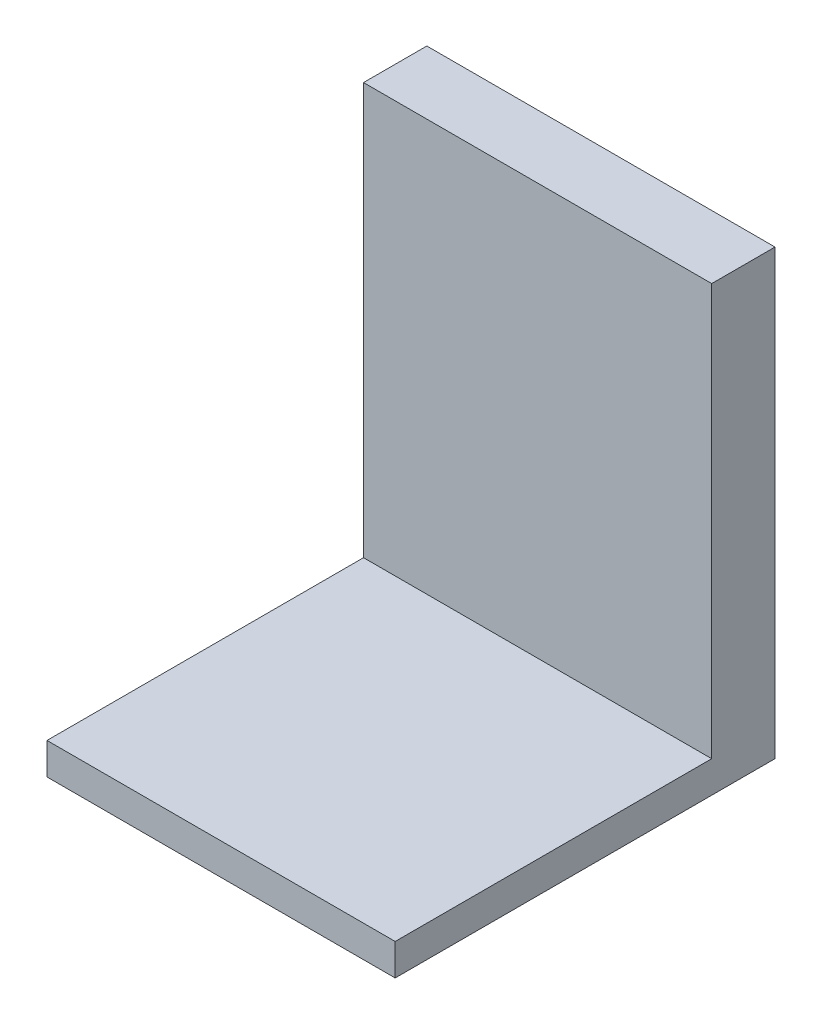
ISO-10303-21;
HEADER;
FILE_DESCRIPTION(('STEP AP214'),'2;1');
FILE_NAME('part.step','',(''),(''),'','','');
FILE_SCHEMA(('AUTOMOTIVE_DESIGN { 1 0 10303 214 1 1 1 1 }'));
ENDSEC;
DATA;
#1=APPLICATION_CONTEXT('core data for automotive mechanical design processes');
#2=APPLICATION_PROTOCOL_DEFINITION('international standard','automotive_design',2000,#1);
#3=PRODUCT_CONTEXT('',#1,'mechanical');
#4=PRODUCT('Part','Part','',(#3));
#5=PRODUCT_RELATED_PRODUCT_CATEGORY('part','',(#4));
#6=PRODUCT_DEFINITION_FORMATION('','',#4);
#7=PRODUCT_DEFINITION_CONTEXT('part definition',#1,'design');
#8=PRODUCT_DEFINITION('design','',#6,#7);
#9=PRODUCT_DEFINITION_SHAPE('','',#8);
#10=(LENGTH_UNIT() NAMED_UNIT(*) SI_UNIT(.MILLI.,.METRE.));
#11=(NAMED_UNIT(*) PLANE_ANGLE_UNIT() SI_UNIT($,.RADIAN.));
#12=(NAMED_UNIT(*) SI_UNIT($,.STERADIAN.) SOLID_ANGLE_UNIT());
#13=UNCERTAINTY_MEASURE_WITH_UNIT(LENGTH_MEASURE(1.E-05),#10,'distance_accuracy_value','');
#14=(GEOMETRIC_REPRESENTATION_CONTEXT(3) GLOBAL_UNCERTAINTY_ASSIGNED_CONTEXT((#13)) GLOBAL_UNIT_ASSIGNED_CONTEXT((#10,
#11,#12)) REPRESENTATION_CONTEXT('',''));
#15=CARTESIAN_POINT('',(0.,0.,0.));
#16=DIRECTION('',(0.,0.,1.));
#17=DIRECTION('',(1.,0.,0.));
#18=AXIS2_PLACEMENT_3D('',#15,#16,#17);
#19=CARTESIAN_POINT('',(0.,530.,0.));
#20=DIRECTION('',(0.,0.,-1.));
#21=DIRECTION('',(-1.,0.,0.));
#22=AXIS2_PLACEMENT_3D('',#19,#20,#21);
#23=PLANE('',#22);
#24=DIRECTION('',(1.,0.,0.));
#25=VECTOR('',#24,1.);
#26=CARTESIAN_POINT('',(9.99999999999982,10.,0.));
#27=LINE('',#26,#25);
#28=CARTESIAN_POINT('',(448.,10.,0.));
#29=VERTEX_POINT('',#28);
#30=CARTESIAN_POINT('',(558.,10.,0.));
#31=VERTEX_POINT('',#30);
#32=EDGE_CURVE('E129',#29,#31,#27,.T.);
#33=ORIENTED_EDGE('',*,*,#32,.F.);
#34=DIRECTION('',(0.,-1.,0.));
#35=VECTOR('',#34,1.);
#36=CARTESIAN_POINT('',(448.,0.,0.));
#37=LINE('',#36,#35);
#38=CARTESIAN_POINT('',(448.,0.,0.));
#39=VERTEX_POINT('',#38);
#40=EDGE_CURVE('E143',#29,#39,#37,.T.);
#41=ORIENTED_EDGE('',*,*,#40,.T.);
#42=DIRECTION('',(1.,0.,0.));
#43=VECTOR('',#42,1.);
#44=CARTESIAN_POINT('',(0.,0.,0.));
#45=LINE('',#44,#43);
#46=CARTESIAN_POINT('',(558.,0.,0.));
#47=VERTEX_POINT('',#46);
#48=EDGE_CURVE('E46',#39,#47,#45,.T.);
#49=ORIENTED_EDGE('',*,*,#48,.T.);
#50=DIRECTION('',(0.,1.,0.));
#51=VECTOR('',#50,1.);
#52=CARTESIAN_POINT('',(558.,0.,0.));
#53=LINE('',#52,#51);
#54=EDGE_CURVE('E142',#47,#31,#53,.T.);
#55=ORIENTED_EDGE('',*,*,#54,.T.);
#56=EDGE_LOOP('',(#33,#41,#49,#55));
#57=FACE_BOUND('',#56,.T.);
#58=ADVANCED_FACE('F38',(#57),#23,.F.);
#59=CARTESIAN_POINT('',(0.,530.,-120.));
#60=DIRECTION('',(0.,0.,1.));
#61=DIRECTION('',(1.,0.,0.));
#62=AXIS2_PLACEMENT_3D('',#59,#60,#61);
#63=PLANE('',#62);
#64=DIRECTION('',(0.,1.,0.));
#65=VECTOR('',#64,1.);
#66=CARTESIAN_POINT('',(448.,530.,-120.));
#67=LINE('',#66,#65);
#68=CARTESIAN_POINT('',(448.,0.,-120.));
#69=VERTEX_POINT('',#68);
#70=CARTESIAN_POINT('',(448.,140.,-120.));
#71=VERTEX_POINT('',#70);
#72=EDGE_CURVE('E105',#69,#71,#67,.T.);
#73=ORIENTED_EDGE('',*,*,#72,.T.);
#74=DIRECTION('',(1.,0.,0.));
#75=VECTOR('',#74,1.);
#76=CARTESIAN_POINT('',(448.,140.,-120.));
#77=LINE('',#76,#75);
#78=CARTESIAN_POINT('',(558.,140.,-120.));
#79=VERTEX_POINT('',#78);
#80=EDGE_CURVE('E53',#71,#79,#77,.T.);
#81=ORIENTED_EDGE('',*,*,#80,.T.);
#82=DIRECTION('',(0.,-1.,0.));
#83=VECTOR('',#82,1.);
#84=CARTESIAN_POINT('',(558.,530.,-120.));
#85=LINE('',#84,#83);
#86=CARTESIAN_POINT('',(558.,0.,-120.));
#87=VERTEX_POINT('',#86);
#88=EDGE_CURVE('E103',#79,#87,#85,.T.);
#89=ORIENTED_EDGE('',*,*,#88,.T.);
#90=DIRECTION('',(-1.,0.,0.));
#91=VECTOR('',#90,1.);
#92=CARTESIAN_POINT('',(0.,0.,-120.));
#93=LINE('',#92,#91);
#94=EDGE_CURVE('E11',#87,#69,#93,.T.);
#95=ORIENTED_EDGE('',*,*,#94,.T.);
#96=EDGE_LOOP('',(#73,#81,#89,#95));
#97=FACE_BOUND('',#96,.T.);
#98=ADVANCED_FACE('F102',(#97),#63,.F.);
#99=CARTESIAN_POINT('',(0.,0.,0.));
#100=DIRECTION('',(0.,-1.,0.));
#101=DIRECTION('',(0.,0.,-1.));
#102=AXIS2_PLACEMENT_3D('',#99,#100,#101);
#103=PLANE('',#102);
#104=DIRECTION('',(0.,0.,-1.));
#105=VECTOR('',#104,1.);
#106=CARTESIAN_POINT('',(448.,0.,0.));
#107=LINE('',#106,#105);
#108=EDGE_CURVE('E147',#39,#69,#107,.T.);
#109=ORIENTED_EDGE('',*,*,#108,.T.);
#110=ORIENTED_EDGE('',*,*,#94,.F.);
#111=DIRECTION('',(0.,0.,-1.));
#112=VECTOR('',#111,1.);
#113=CARTESIAN_POINT('',(558.,0.,0.));
#114=LINE('',#113,#112);
#115=EDGE_CURVE('E110',#47,#87,#114,.T.);
#116=ORIENTED_EDGE('',*,*,#115,.F.);
#117=ORIENTED_EDGE('',*,*,#48,.F.);
#118=EDGE_LOOP('',(#109,#110,#116,#117));
#119=FACE_BOUND('',#118,.T.);
#120=ADVANCED_FACE('F146',(#119),#103,.T.);
#121=CARTESIAN_POINT('',(9.99999999999982,10.,-100.));
#122=DIRECTION('',(0.,-1.,0.));
#123=DIRECTION('',(0.,0.,-1.));
#124=AXIS2_PLACEMENT_3D('',#121,#122,#123);
#125=PLANE('',#124);
#126=DIRECTION('',(1.,0.,0.));
#127=VECTOR('',#126,1.);
#128=CARTESIAN_POINT('',(9.99999999999982,10.,-100.));
#129=LINE('',#128,#127);
#130=CARTESIAN_POINT('',(448.,10.,-100.));
#131=VERTEX_POINT('',#130);
#132=CARTESIAN_POINT('',(558.,10.,-100.));
#133=VERTEX_POINT('',#132);
#134=EDGE_CURVE('E130',#131,#133,#129,.T.);
#135=ORIENTED_EDGE('',*,*,#134,.F.);
#136=DIRECTION('',(0.,0.,1.));
#137=VECTOR('',#136,1.);
#138=CARTESIAN_POINT('',(448.,10.,-100.));
#139=LINE('',#138,#137);
#140=EDGE_CURVE('E117',#131,#29,#139,.T.);
#141=ORIENTED_EDGE('',*,*,#140,.T.);
#142=ORIENTED_EDGE('',*,*,#32,.T.);
#143=DIRECTION('',(0.,0.,-1.));
#144=VECTOR('',#143,1.);
#145=CARTESIAN_POINT('',(558.,10.,-100.));
#146=LINE('',#145,#144);
#147=EDGE_CURVE('E113',#31,#133,#146,.T.);
#148=ORIENTED_EDGE('',*,*,#147,.T.);
#149=EDGE_LOOP('',(#135,#141,#142,#148));
#150=FACE_BOUND('',#149,.T.);
#151=ADVANCED_FACE('F166',(#150),#125,.F.);
#152=CARTESIAN_POINT('',(0.,0.,-100.));
#153=DIRECTION('',(0.,0.,-1.));
#154=DIRECTION('',(-1.,0.,0.));
#155=AXIS2_PLACEMENT_3D('',#152,#153,#154);
#156=PLANE('',#155);
#157=DIRECTION('',(0.,1.,0.));
#158=VECTOR('',#157,1.);
#159=CARTESIAN_POINT('',(558.,0.,-100.));
#160=LINE('',#159,#158);
#161=CARTESIAN_POINT('',(558.,140.,-100.));
#162=VERTEX_POINT('',#161);
#163=EDGE_CURVE('E120',#133,#162,#160,.T.);
#164=ORIENTED_EDGE('',*,*,#163,.T.);
#165=DIRECTION('',(-1.,0.,0.));
#166=VECTOR('',#165,1.);
#167=CARTESIAN_POINT('',(0.,140.,-100.));
#168=LINE('',#167,#166);
#169=CARTESIAN_POINT('',(448.,140.,-100.));
#170=VERTEX_POINT('',#169);
#171=EDGE_CURVE('E93',#162,#170,#168,.T.);
#172=ORIENTED_EDGE('',*,*,#171,.T.);
#173=DIRECTION('',(0.,-1.,0.));
#174=VECTOR('',#173,1.);
#175=CARTESIAN_POINT('',(448.,0.,-100.));
#176=LINE('',#175,#174);
#177=EDGE_CURVE('E61',#170,#131,#176,.T.);
#178=ORIENTED_EDGE('',*,*,#177,.T.);
#179=ORIENTED_EDGE('',*,*,#134,.T.);
#180=EDGE_LOOP('',(#164,#172,#178,#179));
#181=FACE_BOUND('',#180,.T.);
#182=ADVANCED_FACE('F162',(#181),#156,.F.);
#183=CARTESIAN_POINT('',(558.,0.,0.));
#184=DIRECTION('',(-1.,0.,0.));
#185=DIRECTION('',(0.,0.,1.));
#186=AXIS2_PLACEMENT_3D('',#183,#184,#185);
#187=PLANE('',#186);
#188=ORIENTED_EDGE('',*,*,#88,.F.);
#189=DIRECTION('',(0.,0.,1.));
#190=VECTOR('',#189,1.);
#191=CARTESIAN_POINT('',(558.,140.,-120.));
#192=LINE('',#191,#190);
#193=EDGE_CURVE('E91',#79,#162,#192,.T.);
#194=ORIENTED_EDGE('',*,*,#193,.T.);
#195=ORIENTED_EDGE('',*,*,#163,.F.);
#196=ORIENTED_EDGE('',*,*,#147,.F.);
#197=ORIENTED_EDGE('',*,*,#54,.F.);
#198=ORIENTED_EDGE('',*,*,#115,.T.);
#199=EDGE_LOOP('',(#188,#194,#195,#196,#197,#198));
#200=FACE_BOUND('',#199,.T.);
#201=ADVANCED_FACE('F108',(#200),#187,.F.);
#202=CARTESIAN_POINT('',(448.,0.,0.));
#203=DIRECTION('',(1.,0.,0.));
#204=DIRECTION('',(0.,0.,-1.));
#205=AXIS2_PLACEMENT_3D('',#202,#203,#204);
#206=PLANE('',#205);
#207=ORIENTED_EDGE('',*,*,#177,.F.);
#208=DIRECTION('',(0.,0.,1.));
#209=VECTOR('',#208,1.);
#210=CARTESIAN_POINT('',(448.,140.,-120.));
#211=LINE('',#210,#209);
#212=EDGE_CURVE('E98',#71,#170,#211,.T.);
#213=ORIENTED_EDGE('',*,*,#212,.F.);
#214=ORIENTED_EDGE('',*,*,#72,.F.);
#215=ORIENTED_EDGE('',*,*,#108,.F.);
#216=ORIENTED_EDGE('',*,*,#40,.F.);
#217=ORIENTED_EDGE('',*,*,#140,.F.);
#218=EDGE_LOOP('',(#207,#213,#214,#215,#216,#217));
#219=FACE_BOUND('',#218,.T.);
#220=ADVANCED_FACE('F163',(#219),#206,.F.);
#221=CARTESIAN_POINT('',(448.,140.,-120.));
#222=DIRECTION('',(0.,-1.,0.));
#223=DIRECTION('',(0.,0.,-1.));
#224=AXIS2_PLACEMENT_3D('',#221,#222,#223);
#225=PLANE('',#224);
#226=ORIENTED_EDGE('',*,*,#193,.F.);
#227=ORIENTED_EDGE('',*,*,#80,.F.);
#228=ORIENTED_EDGE('',*,*,#212,.T.);
#229=ORIENTED_EDGE('',*,*,#171,.F.);
#230=EDGE_LOOP('',(#226,#227,#228,#229));
#231=FACE_BOUND('',#230,.T.);
#232=ADVANCED_FACE('F92',(#231),#225,.F.);
#233=CLOSED_SHELL('',(#58,#98,#120,#151,#182,#201,#220,#232));
#234=MANIFOLD_SOLID_BREP('B2',#233);
#235=ADVANCED_BREP_SHAPE_REPRESENTATION('',(#18,#234),#14);
#236=SHAPE_DEFINITION_REPRESENTATION(#9,#235);
ENDSEC;
END-ISO-10303-21;
